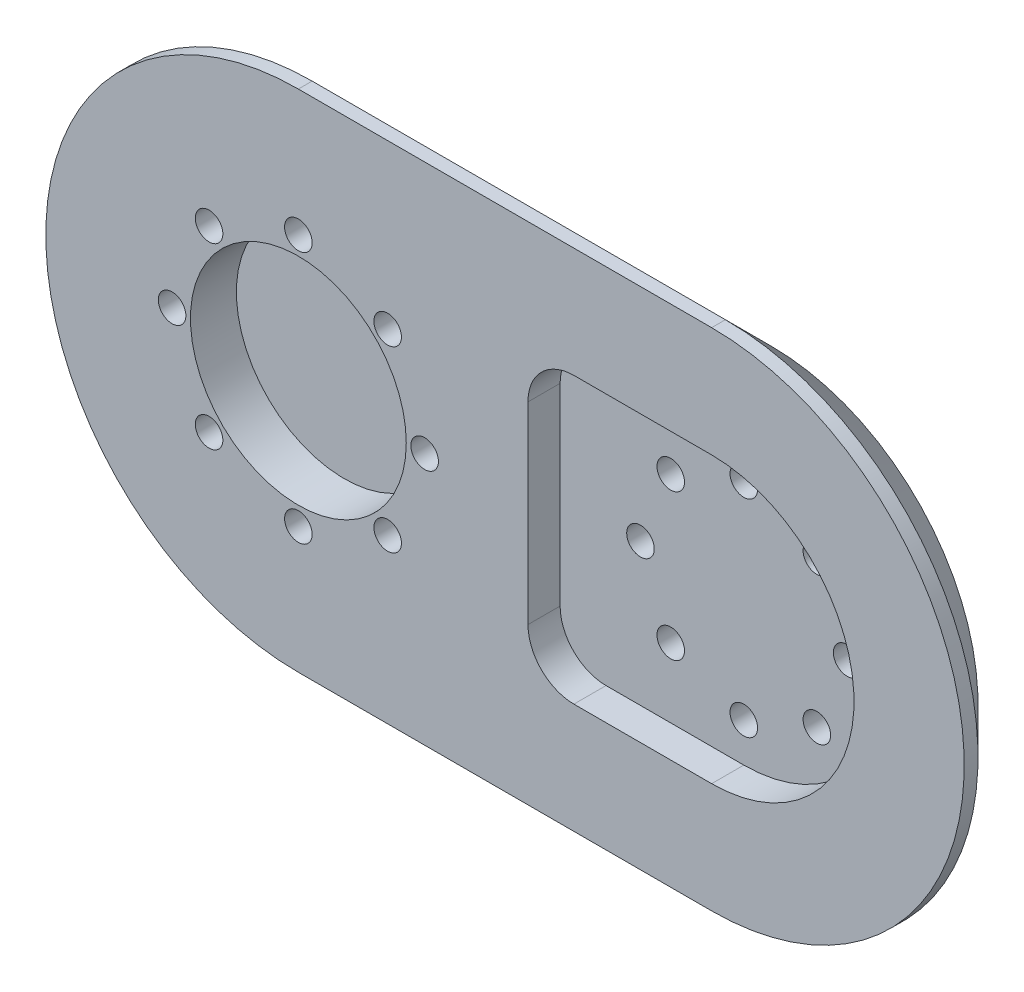
ISO-10303-21;
HEADER;
FILE_DESCRIPTION(('STEP AP214'),'2;1');
FILE_NAME('part.step','',(''),(''),'','','');
FILE_SCHEMA(('AUTOMOTIVE_DESIGN { 1 0 10303 214 1 1 1 1 }'));
ENDSEC;
DATA;
#1=APPLICATION_CONTEXT('core data for automotive mechanical design processes');
#2=APPLICATION_PROTOCOL_DEFINITION('international standard','automotive_design',2000,#1);
#3=PRODUCT_CONTEXT('',#1,'mechanical');
#4=PRODUCT('Part','Part','',(#3));
#5=PRODUCT_RELATED_PRODUCT_CATEGORY('part','',(#4));
#6=PRODUCT_DEFINITION_FORMATION('','',#4);
#7=PRODUCT_DEFINITION_CONTEXT('part definition',#1,'design');
#8=PRODUCT_DEFINITION('design','',#6,#7);
#9=PRODUCT_DEFINITION_SHAPE('','',#8);
#10=(LENGTH_UNIT() NAMED_UNIT(*) SI_UNIT(.MILLI.,.METRE.));
#11=(NAMED_UNIT(*) PLANE_ANGLE_UNIT() SI_UNIT($,.RADIAN.));
#12=(NAMED_UNIT(*) SI_UNIT($,.STERADIAN.) SOLID_ANGLE_UNIT());
#13=UNCERTAINTY_MEASURE_WITH_UNIT(LENGTH_MEASURE(1.E-05),#10,'distance_accuracy_value','');
#14=(GEOMETRIC_REPRESENTATION_CONTEXT(3) GLOBAL_UNCERTAINTY_ASSIGNED_CONTEXT((#13)) GLOBAL_UNIT_ASSIGNED_CONTEXT((#10,
#11,#12)) REPRESENTATION_CONTEXT('',''));
#15=CARTESIAN_POINT('',(0.,0.,0.));
#16=DIRECTION('',(0.,0.,1.));
#17=DIRECTION('',(1.,0.,0.));
#18=AXIS2_PLACEMENT_3D('',#15,#16,#17);
#19=CARTESIAN_POINT('',(0.,0.,13.));
#20=DIRECTION('',(0.,0.,-1.));
#21=DIRECTION('',(-1.,0.,0.));
#22=AXIS2_PLACEMENT_3D('',#19,#20,#21);
#23=CYLINDRICAL_SURFACE('',#22,55.);
#24=DIRECTION('',(0.,0.,-1.));
#25=VECTOR('',#24,1.);
#26=CARTESIAN_POINT('',(0.,55.,13.));
#27=LINE('',#26,#25);
#28=CARTESIAN_POINT('',(0.,55.,13.));
#29=VERTEX_POINT('',#28);
#30=CARTESIAN_POINT('',(0.,55.,10.));
#31=VERTEX_POINT('',#30);
#32=EDGE_CURVE('E155',#29,#31,#27,.T.);
#33=ORIENTED_EDGE('',*,*,#32,.T.);
#34=CARTESIAN_POINT('',(0.,0.,10.));
#35=DIRECTION('',(0.,0.,1.));
#36=DIRECTION('',(1.,0.,0.));
#37=AXIS2_PLACEMENT_3D('',#34,#35,#36);
#38=CIRCLE('',#37,55.);
#39=CARTESIAN_POINT('',(0.,-55.,10.));
#40=VERTEX_POINT('',#39);
#41=EDGE_CURVE('E211',#31,#40,#38,.T.);
#42=ORIENTED_EDGE('',*,*,#41,.T.);
#43=DIRECTION('',(0.,0.,-1.));
#44=VECTOR('',#43,1.);
#45=CARTESIAN_POINT('',(0.,-55.,13.));
#46=LINE('',#45,#44);
#47=CARTESIAN_POINT('',(0.,-55.,13.));
#48=VERTEX_POINT('',#47);
#49=EDGE_CURVE('E164',#48,#40,#46,.T.);
#50=ORIENTED_EDGE('',*,*,#49,.F.);
#51=CARTESIAN_POINT('',(0.,0.,13.));
#52=DIRECTION('',(0.,0.,1.));
#53=DIRECTION('',(1.,0.,0.));
#54=AXIS2_PLACEMENT_3D('',#51,#52,#53);
#55=CIRCLE('',#54,55.);
#56=EDGE_CURVE('E139',#29,#48,#55,.T.);
#57=ORIENTED_EDGE('',*,*,#56,.F.);
#58=EDGE_LOOP('',(#33,#42,#50,#57));
#59=FACE_BOUND('',#58,.T.);
#60=ADVANCED_FACE('F30',(#59),#23,.T.);
#61=CARTESIAN_POINT('',(0.,-55.,13.));
#62=DIRECTION('',(0.,1.,0.));
#63=DIRECTION('',(0.,0.,1.));
#64=AXIS2_PLACEMENT_3D('',#61,#62,#63);
#65=PLANE('',#64);
#66=ORIENTED_EDGE('',*,*,#49,.T.);
#67=DIRECTION('',(1.,0.,0.));
#68=VECTOR('',#67,1.);
#69=CARTESIAN_POINT('',(0.,-55.,10.));
#70=LINE('',#69,#68);
#71=CARTESIAN_POINT('',(90.,-55.,10.));
#72=VERTEX_POINT('',#71);
#73=EDGE_CURVE('E167',#40,#72,#70,.T.);
#74=ORIENTED_EDGE('',*,*,#73,.T.);
#75=DIRECTION('',(0.,0.,-1.));
#76=VECTOR('',#75,1.);
#77=CARTESIAN_POINT('',(90.,-55.,13.));
#78=LINE('',#77,#76);
#79=CARTESIAN_POINT('',(90.,-55.,13.));
#80=VERTEX_POINT('',#79);
#81=EDGE_CURVE('E161',#80,#72,#78,.T.);
#82=ORIENTED_EDGE('',*,*,#81,.F.);
#83=DIRECTION('',(1.,0.,0.));
#84=VECTOR('',#83,1.);
#85=CARTESIAN_POINT('',(0.,-55.,13.));
#86=LINE('',#85,#84);
#87=EDGE_CURVE('E142',#48,#80,#86,.T.);
#88=ORIENTED_EDGE('',*,*,#87,.F.);
#89=EDGE_LOOP('',(#66,#74,#82,#88));
#90=FACE_BOUND('',#89,.T.);
#91=ADVANCED_FACE('F302',(#90),#65,.F.);
#92=CARTESIAN_POINT('',(90.,0.,13.));
#93=DIRECTION('',(0.,0.,-1.));
#94=DIRECTION('',(-1.,0.,0.));
#95=AXIS2_PLACEMENT_3D('',#92,#93,#94);
#96=CYLINDRICAL_SURFACE('',#95,55.);
#97=ORIENTED_EDGE('',*,*,#81,.T.);
#98=CARTESIAN_POINT('',(90.,0.,10.));
#99=DIRECTION('',(0.,0.,1.));
#100=DIRECTION('',(1.,0.,0.));
#101=AXIS2_PLACEMENT_3D('',#98,#99,#100);
#102=CIRCLE('',#101,55.);
#103=CARTESIAN_POINT('',(90.,55.,10.));
#104=VERTEX_POINT('',#103);
#105=EDGE_CURVE('E209',#72,#104,#102,.T.);
#106=ORIENTED_EDGE('',*,*,#105,.T.);
#107=DIRECTION('',(0.,0.,-1.));
#108=VECTOR('',#107,1.);
#109=CARTESIAN_POINT('',(90.,55.,13.));
#110=LINE('',#109,#108);
#111=CARTESIAN_POINT('',(90.,55.,13.));
#112=VERTEX_POINT('',#111);
#113=EDGE_CURVE('E158',#112,#104,#110,.T.);
#114=ORIENTED_EDGE('',*,*,#113,.F.);
#115=CARTESIAN_POINT('',(90.,0.,13.));
#116=DIRECTION('',(0.,0.,1.));
#117=DIRECTION('',(1.,0.,0.));
#118=AXIS2_PLACEMENT_3D('',#115,#116,#117);
#119=CIRCLE('',#118,55.);
#120=EDGE_CURVE('E151',#80,#112,#119,.T.);
#121=ORIENTED_EDGE('',*,*,#120,.F.);
#122=EDGE_LOOP('',(#97,#106,#114,#121));
#123=FACE_BOUND('',#122,.T.);
#124=ADVANCED_FACE('F308',(#123),#96,.T.);
#125=CARTESIAN_POINT('',(0.,55.,13.));
#126=DIRECTION('',(0.,-1.,0.));
#127=DIRECTION('',(0.,0.,-1.));
#128=AXIS2_PLACEMENT_3D('',#125,#126,#127);
#129=PLANE('',#128);
#130=ORIENTED_EDGE('',*,*,#113,.T.);
#131=DIRECTION('',(-1.,0.,0.));
#132=VECTOR('',#131,1.);
#133=CARTESIAN_POINT('',(0.,55.,10.));
#134=LINE('',#133,#132);
#135=EDGE_CURVE('E213',#104,#31,#134,.T.);
#136=ORIENTED_EDGE('',*,*,#135,.T.);
#137=ORIENTED_EDGE('',*,*,#32,.F.);
#138=DIRECTION('',(-1.,0.,0.));
#139=VECTOR('',#138,1.);
#140=CARTESIAN_POINT('',(0.,55.,13.));
#141=LINE('',#140,#139);
#142=EDGE_CURVE('E153',#112,#29,#141,.T.);
#143=ORIENTED_EDGE('',*,*,#142,.F.);
#144=EDGE_LOOP('',(#130,#136,#137,#143));
#145=FACE_BOUND('',#144,.T.);
#146=ADVANCED_FACE('F521',(#145),#129,.F.);
#147=CARTESIAN_POINT('',(0.,0.,13.));
#148=DIRECTION('',(0.,0.,1.));
#149=DIRECTION('',(1.,0.,0.));
#150=AXIS2_PLACEMENT_3D('',#147,#148,#149);
#151=PLANE('',#150);
#152=CARTESIAN_POINT('',(0.,0.,13.));
#153=DIRECTION('',(0.,0.,1.));
#154=DIRECTION('',(1.,0.,0.));
#155=AXIS2_PLACEMENT_3D('',#152,#153,#154);
#156=CIRCLE('',#155,23.5);
#157=CARTESIAN_POINT('',(23.5,0.,13.));
#158=VERTEX_POINT('',#157);
#159=EDGE_CURVE('E646',#158,#158,#156,.T.);
#160=ORIENTED_EDGE('',*,*,#159,.F.);
#161=EDGE_LOOP('',(#160));
#162=FACE_BOUND('',#161,.T.);
#163=CARTESIAN_POINT('',(19.4454364826298,19.4454364826303,13.));
#164=DIRECTION('',(0.,0.,1.));
#165=DIRECTION('',(1.,0.,0.));
#166=AXIS2_PLACEMENT_3D('',#163,#164,#165);
#167=CIRCLE('',#166,3.);
#168=CARTESIAN_POINT('',(22.4454364826298,19.4454364826303,13.));
#169=VERTEX_POINT('',#168);
#170=EDGE_CURVE('E649',#169,#169,#167,.T.);
#171=ORIENTED_EDGE('',*,*,#170,.F.);
#172=EDGE_LOOP('',(#171));
#173=FACE_BOUND('',#172,.T.);
#174=CARTESIAN_POINT('',(27.4999999999996,-3.96569718509096E-13,13.));
#175=DIRECTION('',(0.,0.,1.));
#176=DIRECTION('',(1.,0.,0.));
#177=AXIS2_PLACEMENT_3D('',#174,#175,#176);
#178=CIRCLE('',#177,3.00000000000077);
#179=CARTESIAN_POINT('',(30.5000000000004,-3.96569718509096E-13,13.));
#180=VERTEX_POINT('',#179);
#181=EDGE_CURVE('E658',#180,#180,#178,.T.);
#182=ORIENTED_EDGE('',*,*,#181,.F.);
#183=EDGE_LOOP('',(#182));
#184=FACE_BOUND('',#183,.T.);
#185=CARTESIAN_POINT('',(19.4454364826294,-19.4454364826303,13.));
#186=DIRECTION('',(0.,0.,1.));
#187=DIRECTION('',(1.,0.,0.));
#188=AXIS2_PLACEMENT_3D('',#185,#186,#187);
#189=CIRCLE('',#188,3.00000000000095);
#190=CARTESIAN_POINT('',(22.4454364826303,-19.4454364826303,13.));
#191=VERTEX_POINT('',#190);
#192=EDGE_CURVE('E664',#191,#191,#189,.T.);
#193=ORIENTED_EDGE('',*,*,#192,.F.);
#194=EDGE_LOOP('',(#193));
#195=FACE_BOUND('',#194,.T.);
#196=CARTESIAN_POINT('',(-7.78877188487905E-13,-27.5,13.));
#197=DIRECTION('',(0.,0.,1.));
#198=DIRECTION('',(1.,0.,0.));
#199=AXIS2_PLACEMENT_3D('',#196,#197,#198);
#200=CIRCLE('',#199,3.00000000000093);
#201=CARTESIAN_POINT('',(3.00000000000015,-27.5,13.));
#202=VERTEX_POINT('',#201);
#203=EDGE_CURVE('E670',#202,#202,#200,.T.);
#204=ORIENTED_EDGE('',*,*,#203,.F.);
#205=EDGE_LOOP('',(#204));
#206=FACE_BOUND('',#205,.T.);
#207=CARTESIAN_POINT('',(-19.4454364826307,-19.4454364826298,13.));
#208=DIRECTION('',(0.,0.,1.));
#209=DIRECTION('',(1.,0.,0.));
#210=AXIS2_PLACEMENT_3D('',#207,#208,#209);
#211=CIRCLE('',#210,3.00000000000069);
#212=CARTESIAN_POINT('',(-16.44543648263,-19.4454364826298,13.));
#213=VERTEX_POINT('',#212);
#214=EDGE_CURVE('E676',#213,#213,#211,.T.);
#215=ORIENTED_EDGE('',*,*,#214,.F.);
#216=EDGE_LOOP('',(#215));
#217=FACE_BOUND('',#216,.T.);
#218=CARTESIAN_POINT('',(-27.5,0.,13.));
#219=DIRECTION('',(0.,0.,1.));
#220=DIRECTION('',(1.,0.,0.));
#221=AXIS2_PLACEMENT_3D('',#218,#219,#220);
#222=CIRCLE('',#221,3.);
#223=CARTESIAN_POINT('',(-24.5,0.,13.));
#224=VERTEX_POINT('',#223);
#225=EDGE_CURVE('E682',#224,#224,#222,.T.);
#226=ORIENTED_EDGE('',*,*,#225,.F.);
#227=EDGE_LOOP('',(#226));
#228=FACE_BOUND('',#227,.T.);
#229=CARTESIAN_POINT('',(-19.4454364826301,19.44543648263,13.));
#230=DIRECTION('',(0.,0.,1.));
#231=DIRECTION('',(1.,0.,0.));
#232=AXIS2_PLACEMENT_3D('',#229,#230,#231);
#233=CIRCLE('',#232,3.);
#234=CARTESIAN_POINT('',(-16.4454364826301,19.44543648263,13.));
#235=VERTEX_POINT('',#234);
#236=EDGE_CURVE('E688',#235,#235,#233,.T.);
#237=ORIENTED_EDGE('',*,*,#236,.F.);
#238=EDGE_LOOP('',(#237));
#239=FACE_BOUND('',#238,.T.);
#240=CARTESIAN_POINT('',(0.,27.5,13.));
#241=DIRECTION('',(0.,0.,1.));
#242=DIRECTION('',(1.,0.,0.));
#243=AXIS2_PLACEMENT_3D('',#240,#241,#242);
#244=CIRCLE('',#243,3.);
#245=CARTESIAN_POINT('',(3.,27.5,13.));
#246=VERTEX_POINT('',#245);
#247=EDGE_CURVE('E249',#246,#246,#244,.T.);
#248=ORIENTED_EDGE('',*,*,#247,.F.);
#249=EDGE_LOOP('',(#248));
#250=FACE_BOUND('',#249,.T.);
#251=DIRECTION('',(-1.,0.,0.));
#252=VECTOR('',#251,1.);
#253=CARTESIAN_POINT('',(50.,31.,13.));
#254=LINE('',#253,#252);
#255=CARTESIAN_POINT('',(90.,31.,13.));
#256=VERTEX_POINT('',#255);
#257=CARTESIAN_POINT('',(60.,31.,13.));
#258=VERTEX_POINT('',#257);
#259=EDGE_CURVE('E257',#256,#258,#254,.T.);
#260=ORIENTED_EDGE('',*,*,#259,.F.);
#261=CARTESIAN_POINT('',(90.,0.,13.));
#262=DIRECTION('',(0.,0.,1.));
#263=DIRECTION('',(1.,0.,0.));
#264=AXIS2_PLACEMENT_3D('',#261,#262,#263);
#265=CIRCLE('',#264,31.);
#266=CARTESIAN_POINT('',(90.,-31.,13.));
#267=VERTEX_POINT('',#266);
#268=EDGE_CURVE('E132',#267,#256,#265,.T.);
#269=ORIENTED_EDGE('',*,*,#268,.F.);
#270=DIRECTION('',(1.,0.,0.));
#271=VECTOR('',#270,1.);
#272=CARTESIAN_POINT('',(50.,-31.,13.));
#273=LINE('',#272,#271);
#274=CARTESIAN_POINT('',(60.,-31.,13.));
#275=VERTEX_POINT('',#274);
#276=EDGE_CURVE('E241',#275,#267,#273,.T.);
#277=ORIENTED_EDGE('',*,*,#276,.F.);
#278=CARTESIAN_POINT('',(60.,-21.,13.));
#279=DIRECTION('',(0.,0.,1.));
#280=DIRECTION('',(1.,0.,0.));
#281=AXIS2_PLACEMENT_3D('',#278,#279,#280);
#282=CIRCLE('',#281,10.);
#283=CARTESIAN_POINT('',(50.,-21.,13.));
#284=VERTEX_POINT('',#283);
#285=EDGE_CURVE('E38',#275,#284,#282,.F.);
#286=ORIENTED_EDGE('',*,*,#285,.T.);
#287=DIRECTION('',(0.,-1.,0.));
#288=VECTOR('',#287,1.);
#289=CARTESIAN_POINT('',(50.,31.,13.));
#290=LINE('',#289,#288);
#291=CARTESIAN_POINT('',(50.,21.,13.));
#292=VERTEX_POINT('',#291);
#293=EDGE_CURVE('E240',#292,#284,#290,.T.);
#294=ORIENTED_EDGE('',*,*,#293,.F.);
#295=CARTESIAN_POINT('',(60.,21.,13.));
#296=DIRECTION('',(0.,0.,1.));
#297=DIRECTION('',(1.,0.,0.));
#298=AXIS2_PLACEMENT_3D('',#295,#296,#297);
#299=CIRCLE('',#298,10.);
#300=EDGE_CURVE('E11',#292,#258,#299,.F.);
#301=ORIENTED_EDGE('',*,*,#300,.T.);
#302=EDGE_LOOP('',(#260,#269,#277,#286,#294,#301));
#303=FACE_BOUND('',#302,.T.);
#304=ORIENTED_EDGE('',*,*,#56,.T.);
#305=ORIENTED_EDGE('',*,*,#87,.T.);
#306=ORIENTED_EDGE('',*,*,#120,.T.);
#307=ORIENTED_EDGE('',*,*,#142,.T.);
#308=EDGE_LOOP('',(#304,#305,#306,#307));
#309=FACE_BOUND('',#308,.T.);
#310=ADVANCED_FACE('F238',(#162,#173,#184,#195,#206,#217,#228,#239,#250,#303,#309),#151,.T.);
#311=CARTESIAN_POINT('',(0.,0.,0.));
#312=DIRECTION('',(0.,0.,1.));
#313=DIRECTION('',(1.,0.,0.));
#314=AXIS2_PLACEMENT_3D('',#311,#312,#313);
#315=PLANE('',#314);
#316=CARTESIAN_POINT('',(19.4454364826298,19.4454364826303,0.));
#317=DIRECTION('',(0.,0.,-1.));
#318=DIRECTION('',(-1.,0.,0.));
#319=AXIS2_PLACEMENT_3D('',#316,#317,#318);
#320=CIRCLE('',#319,3.);
#321=CARTESIAN_POINT('',(16.4454364826298,19.4454364826303,0.));
#322=VERTEX_POINT('',#321);
#323=EDGE_CURVE('E645',#322,#322,#320,.T.);
#324=ORIENTED_EDGE('',*,*,#323,.F.);
#325=EDGE_LOOP('',(#324));
#326=FACE_BOUND('',#325,.T.);
#327=CARTESIAN_POINT('',(27.4999999999996,-3.96569718509096E-13,0.));
#328=DIRECTION('',(0.,0.,-1.));
#329=DIRECTION('',(-1.,0.,0.));
#330=AXIS2_PLACEMENT_3D('',#327,#328,#329);
#331=CIRCLE('',#330,3.00000000000077);
#332=CARTESIAN_POINT('',(24.4999999999988,-3.96569718509096E-13,0.));
#333=VERTEX_POINT('',#332);
#334=EDGE_CURVE('E655',#333,#333,#331,.T.);
#335=ORIENTED_EDGE('',*,*,#334,.F.);
#336=EDGE_LOOP('',(#335));
#337=FACE_BOUND('',#336,.T.);
#338=CARTESIAN_POINT('',(19.4454364826294,-19.4454364826303,0.));
#339=DIRECTION('',(0.,0.,-1.));
#340=DIRECTION('',(-1.,0.,0.));
#341=AXIS2_PLACEMENT_3D('',#338,#339,#340);
#342=CIRCLE('',#341,3.00000000000095);
#343=CARTESIAN_POINT('',(16.4454364826284,-19.4454364826303,0.));
#344=VERTEX_POINT('',#343);
#345=EDGE_CURVE('E661',#344,#344,#342,.T.);
#346=ORIENTED_EDGE('',*,*,#345,.F.);
#347=EDGE_LOOP('',(#346));
#348=FACE_BOUND('',#347,.T.);
#349=CARTESIAN_POINT('',(-7.78877188487905E-13,-27.5,0.));
#350=DIRECTION('',(0.,0.,-1.));
#351=DIRECTION('',(-1.,0.,0.));
#352=AXIS2_PLACEMENT_3D('',#349,#350,#351);
#353=CIRCLE('',#352,3.00000000000093);
#354=CARTESIAN_POINT('',(-3.00000000000171,-27.5,0.));
#355=VERTEX_POINT('',#354);
#356=EDGE_CURVE('E667',#355,#355,#353,.T.);
#357=ORIENTED_EDGE('',*,*,#356,.F.);
#358=EDGE_LOOP('',(#357));
#359=FACE_BOUND('',#358,.T.);
#360=CARTESIAN_POINT('',(-19.4454364826307,-19.4454364826298,0.));
#361=DIRECTION('',(0.,0.,-1.));
#362=DIRECTION('',(-1.,0.,0.));
#363=AXIS2_PLACEMENT_3D('',#360,#361,#362);
#364=CIRCLE('',#363,3.00000000000069);
#365=CARTESIAN_POINT('',(-22.4454364826314,-19.4454364826298,0.));
#366=VERTEX_POINT('',#365);
#367=EDGE_CURVE('E673',#366,#366,#364,.T.);
#368=ORIENTED_EDGE('',*,*,#367,.F.);
#369=EDGE_LOOP('',(#368));
#370=FACE_BOUND('',#369,.T.);
#371=CARTESIAN_POINT('',(-27.5,0.,0.));
#372=DIRECTION('',(0.,0.,-1.));
#373=DIRECTION('',(-1.,0.,0.));
#374=AXIS2_PLACEMENT_3D('',#371,#372,#373);
#375=CIRCLE('',#374,3.);
#376=CARTESIAN_POINT('',(-30.5,0.,0.));
#377=VERTEX_POINT('',#376);
#378=EDGE_CURVE('E679',#377,#377,#375,.T.);
#379=ORIENTED_EDGE('',*,*,#378,.F.);
#380=EDGE_LOOP('',(#379));
#381=FACE_BOUND('',#380,.T.);
#382=CARTESIAN_POINT('',(-19.4454364826301,19.44543648263,0.));
#383=DIRECTION('',(0.,0.,-1.));
#384=DIRECTION('',(-1.,0.,0.));
#385=AXIS2_PLACEMENT_3D('',#382,#383,#384);
#386=CIRCLE('',#385,3.);
#387=CARTESIAN_POINT('',(-22.4454364826301,19.44543648263,0.));
#388=VERTEX_POINT('',#387);
#389=EDGE_CURVE('E685',#388,#388,#386,.T.);
#390=ORIENTED_EDGE('',*,*,#389,.F.);
#391=EDGE_LOOP('',(#390));
#392=FACE_BOUND('',#391,.T.);
#393=CARTESIAN_POINT('',(0.,27.5,0.));
#394=DIRECTION('',(0.,0.,-1.));
#395=DIRECTION('',(-1.,0.,0.));
#396=AXIS2_PLACEMENT_3D('',#393,#394,#395);
#397=CIRCLE('',#396,3.);
#398=CARTESIAN_POINT('',(-3.,27.5,0.));
#399=VERTEX_POINT('',#398);
#400=EDGE_CURVE('E691',#399,#399,#397,.T.);
#401=ORIENTED_EDGE('',*,*,#400,.F.);
#402=EDGE_LOOP('',(#401));
#403=FACE_BOUND('',#402,.T.);
#404=CARTESIAN_POINT('',(90.,0.,0.));
#405=DIRECTION('',(0.,0.,1.));
#406=DIRECTION('',(1.,0.,0.));
#407=AXIS2_PLACEMENT_3D('',#404,#405,#406);
#408=CIRCLE('',#407,45.);
#409=CARTESIAN_POINT('',(90.,45.,0.));
#410=VERTEX_POINT('',#409);
#411=CARTESIAN_POINT('',(90.,-45.,0.));
#412=VERTEX_POINT('',#411);
#413=EDGE_CURVE('E204',#410,#412,#408,.F.);
#414=ORIENTED_EDGE('',*,*,#413,.T.);
#415=DIRECTION('',(-1.,0.,0.));
#416=VECTOR('',#415,1.);
#417=CARTESIAN_POINT('',(0.,-45.,0.));
#418=LINE('',#417,#416);
#419=CARTESIAN_POINT('',(0.,-45.,0.));
#420=VERTEX_POINT('',#419);
#421=EDGE_CURVE('E206',#412,#420,#418,.T.);
#422=ORIENTED_EDGE('',*,*,#421,.T.);
#423=CARTESIAN_POINT('',(0.,0.,0.));
#424=DIRECTION('',(0.,0.,1.));
#425=DIRECTION('',(1.,0.,0.));
#426=AXIS2_PLACEMENT_3D('',#423,#424,#425);
#427=CIRCLE('',#426,45.);
#428=CARTESIAN_POINT('',(0.,45.,0.));
#429=VERTEX_POINT('',#428);
#430=EDGE_CURVE('E202',#420,#429,#427,.F.);
#431=ORIENTED_EDGE('',*,*,#430,.T.);
#432=DIRECTION('',(1.,0.,0.));
#433=VECTOR('',#432,1.);
#434=CARTESIAN_POINT('',(0.,45.,0.));
#435=LINE('',#434,#433);
#436=EDGE_CURVE('E200',#429,#410,#435,.T.);
#437=ORIENTED_EDGE('',*,*,#436,.T.);
#438=EDGE_LOOP('',(#414,#422,#431,#437));
#439=FACE_BOUND('',#438,.T.);
#440=CARTESIAN_POINT('',(105.909902576697,15.9099025766976,0.));
#441=DIRECTION('',(0.,0.,-1.));
#442=DIRECTION('',(-1.,0.,0.));
#443=AXIS2_PLACEMENT_3D('',#440,#441,#442);
#444=CIRCLE('',#443,3.00000000000001);
#445=CARTESIAN_POINT('',(102.909902576697,15.9099025766976,0.));
#446=VERTEX_POINT('',#445);
#447=EDGE_CURVE('E197',#446,#446,#444,.T.);
#448=ORIENTED_EDGE('',*,*,#447,.F.);
#449=EDGE_LOOP('',(#448));
#450=FACE_BOUND('',#449,.T.);
#451=CARTESIAN_POINT('',(112.5,1.2490009027033E-13,0.));
#452=DIRECTION('',(0.,0.,-1.));
#453=DIRECTION('',(-1.,0.,0.));
#454=AXIS2_PLACEMENT_3D('',#451,#452,#453);
#455=CIRCLE('',#454,3.00000000000001);
#456=CARTESIAN_POINT('',(109.5,1.2490009027033E-13,0.));
#457=VERTEX_POINT('',#456);
#458=EDGE_CURVE('E193',#457,#457,#455,.T.);
#459=ORIENTED_EDGE('',*,*,#458,.F.);
#460=EDGE_LOOP('',(#459));
#461=FACE_BOUND('',#460,.T.);
#462=CARTESIAN_POINT('',(105.909902576697,-15.9099025766971,0.));
#463=DIRECTION('',(0.,0.,-1.));
#464=DIRECTION('',(-1.,0.,0.));
#465=AXIS2_PLACEMENT_3D('',#462,#463,#464);
#466=CIRCLE('',#465,3.00000000000001);
#467=CARTESIAN_POINT('',(102.909902576697,-15.9099025766971,0.));
#468=VERTEX_POINT('',#467);
#469=EDGE_CURVE('E189',#468,#468,#466,.T.);
#470=ORIENTED_EDGE('',*,*,#469,.F.);
#471=EDGE_LOOP('',(#470));
#472=FACE_BOUND('',#471,.T.);
#473=CARTESIAN_POINT('',(89.9999999999998,-22.4999999999982,0.));
#474=DIRECTION('',(0.,0.,-1.));
#475=DIRECTION('',(-1.,0.,0.));
#476=AXIS2_PLACEMENT_3D('',#473,#474,#475);
#477=CIRCLE('',#476,3.00000000000001);
#478=CARTESIAN_POINT('',(86.9999999999998,-22.4999999999982,0.));
#479=VERTEX_POINT('',#478);
#480=EDGE_CURVE('E185',#479,#479,#477,.T.);
#481=ORIENTED_EDGE('',*,*,#480,.F.);
#482=EDGE_LOOP('',(#481));
#483=FACE_BOUND('',#482,.T.);
#484=CARTESIAN_POINT('',(74.0900974233035,-15.9099025766959,0.));
#485=DIRECTION('',(0.,0.,-1.));
#486=DIRECTION('',(-1.,0.,0.));
#487=AXIS2_PLACEMENT_3D('',#484,#485,#486);
#488=CIRCLE('',#487,3.00000000000001);
#489=CARTESIAN_POINT('',(71.0900974233034,-15.9099025766959,0.));
#490=VERTEX_POINT('',#489);
#491=EDGE_CURVE('E181',#490,#490,#488,.T.);
#492=ORIENTED_EDGE('',*,*,#491,.F.);
#493=EDGE_LOOP('',(#492));
#494=FACE_BOUND('',#493,.T.);
#495=CARTESIAN_POINT('',(67.5000000000012,5.55111512312578E-13,0.));
#496=DIRECTION('',(0.,0.,-1.));
#497=DIRECTION('',(-1.,0.,0.));
#498=AXIS2_PLACEMENT_3D('',#495,#496,#497);
#499=CIRCLE('',#498,3.00000000000001);
#500=CARTESIAN_POINT('',(64.5000000000012,5.55111512312578E-13,0.));
#501=VERTEX_POINT('',#500);
#502=EDGE_CURVE('E177',#501,#501,#499,.T.);
#503=ORIENTED_EDGE('',*,*,#502,.F.);
#504=EDGE_LOOP('',(#503));
#505=FACE_BOUND('',#504,.T.);
#506=CARTESIAN_POINT('',(74.0900974233036,15.9099025766969,0.));
#507=DIRECTION('',(0.,0.,-1.));
#508=DIRECTION('',(-1.,0.,0.));
#509=AXIS2_PLACEMENT_3D('',#506,#507,#508);
#510=CIRCLE('',#509,3.00000000000001);
#511=CARTESIAN_POINT('',(71.0900974233036,15.9099025766969,0.));
#512=VERTEX_POINT('',#511);
#513=EDGE_CURVE('E173',#512,#512,#510,.T.);
#514=ORIENTED_EDGE('',*,*,#513,.F.);
#515=EDGE_LOOP('',(#514));
#516=FACE_BOUND('',#515,.T.);
#517=CARTESIAN_POINT('',(90.,22.4999999999991,0.));
#518=DIRECTION('',(0.,0.,-1.));
#519=DIRECTION('',(-1.,0.,0.));
#520=AXIS2_PLACEMENT_3D('',#517,#518,#519);
#521=CIRCLE('',#520,3.00000000000001);
#522=CARTESIAN_POINT('',(87.,22.4999999999991,0.));
#523=VERTEX_POINT('',#522);
#524=EDGE_CURVE('E147',#523,#523,#521,.T.);
#525=ORIENTED_EDGE('',*,*,#524,.F.);
#526=EDGE_LOOP('',(#525));
#527=FACE_BOUND('',#526,.T.);
#528=ADVANCED_FACE('F280',(#326,#337,#348,#359,#370,#381,#392,#403,#439,#450,#461,#472,#483,
#494,#505,#516,#527),#315,.F.);
#529=CARTESIAN_POINT('',(90.,0.,6.));
#530=DIRECTION('',(0.,0.,1.));
#531=DIRECTION('',(1.,0.,0.));
#532=AXIS2_PLACEMENT_3D('',#529,#530,#531);
#533=CYLINDRICAL_SURFACE('',#532,31.);
#534=ORIENTED_EDGE('',*,*,#268,.T.);
#535=DIRECTION('',(0.,0.,1.));
#536=VECTOR('',#535,1.);
#537=CARTESIAN_POINT('',(90.,31.,6.));
#538=LINE('',#537,#536);
#539=CARTESIAN_POINT('',(90.,31.,6.));
#540=VERTEX_POINT('',#539);
#541=EDGE_CURVE('E118',#540,#256,#538,.T.);
#542=ORIENTED_EDGE('',*,*,#541,.F.);
#543=CARTESIAN_POINT('',(90.,0.,6.));
#544=DIRECTION('',(0.,0.,1.));
#545=DIRECTION('',(1.,0.,0.));
#546=AXIS2_PLACEMENT_3D('',#543,#544,#545);
#547=CIRCLE('',#546,31.);
#548=CARTESIAN_POINT('',(90.,-31.,6.));
#549=VERTEX_POINT('',#548);
#550=EDGE_CURVE('E130',#549,#540,#547,.T.);
#551=ORIENTED_EDGE('',*,*,#550,.F.);
#552=DIRECTION('',(0.,0.,1.));
#553=VECTOR('',#552,1.);
#554=CARTESIAN_POINT('',(90.,-31.,6.));
#555=LINE('',#554,#553);
#556=EDGE_CURVE('E122',#549,#267,#555,.T.);
#557=ORIENTED_EDGE('',*,*,#556,.T.);
#558=EDGE_LOOP('',(#534,#542,#551,#557));
#559=FACE_BOUND('',#558,.T.);
#560=ADVANCED_FACE('F128',(#559),#533,.F.);
#561=CARTESIAN_POINT('',(90.,0.,6.));
#562=DIRECTION('',(0.,0.,1.));
#563=DIRECTION('',(1.,0.,0.));
#564=AXIS2_PLACEMENT_3D('',#561,#562,#563);
#565=PLANE('',#564);
#566=CARTESIAN_POINT('',(105.909902576697,15.9099025766976,6.));
#567=DIRECTION('',(0.,0.,1.));
#568=DIRECTION('',(1.,0.,0.));
#569=AXIS2_PLACEMENT_3D('',#566,#567,#568);
#570=CIRCLE('',#569,3.00000000000001);
#571=CARTESIAN_POINT('',(108.909902576697,15.9099025766976,6.));
#572=VERTEX_POINT('',#571);
#573=EDGE_CURVE('E194',#572,#572,#570,.T.);
#574=ORIENTED_EDGE('',*,*,#573,.F.);
#575=EDGE_LOOP('',(#574));
#576=FACE_BOUND('',#575,.T.);
#577=CARTESIAN_POINT('',(112.5,1.24608656726366E-13,6.));
#578=DIRECTION('',(0.,0.,1.));
#579=DIRECTION('',(1.,0.,0.));
#580=AXIS2_PLACEMENT_3D('',#577,#578,#579);
#581=CIRCLE('',#580,3.00000000000001);
#582=CARTESIAN_POINT('',(115.5,1.24608656726366E-13,6.));
#583=VERTEX_POINT('',#582);
#584=EDGE_CURVE('E190',#583,#583,#581,.T.);
#585=ORIENTED_EDGE('',*,*,#584,.F.);
#586=EDGE_LOOP('',(#585));
#587=FACE_BOUND('',#586,.T.);
#588=CARTESIAN_POINT('',(105.909902576697,-15.9099025766971,6.));
#589=DIRECTION('',(0.,0.,1.));
#590=DIRECTION('',(1.,0.,0.));
#591=AXIS2_PLACEMENT_3D('',#588,#589,#590);
#592=CIRCLE('',#591,3.00000000000001);
#593=CARTESIAN_POINT('',(108.909902576697,-15.9099025766971,6.));
#594=VERTEX_POINT('',#593);
#595=EDGE_CURVE('E186',#594,#594,#592,.T.);
#596=ORIENTED_EDGE('',*,*,#595,.F.);
#597=EDGE_LOOP('',(#596));
#598=FACE_BOUND('',#597,.T.);
#599=CARTESIAN_POINT('',(89.9999999999998,-22.4999999999982,6.));
#600=DIRECTION('',(0.,0.,1.));
#601=DIRECTION('',(1.,0.,0.));
#602=AXIS2_PLACEMENT_3D('',#599,#600,#601);
#603=CIRCLE('',#602,3.00000000000001);
#604=CARTESIAN_POINT('',(92.9999999999998,-22.4999999999982,6.));
#605=VERTEX_POINT('',#604);
#606=EDGE_CURVE('E182',#605,#605,#603,.T.);
#607=ORIENTED_EDGE('',*,*,#606,.F.);
#608=EDGE_LOOP('',(#607));
#609=FACE_BOUND('',#608,.T.);
#610=CARTESIAN_POINT('',(74.0900974233035,-15.9099025766959,6.));
#611=DIRECTION('',(0.,0.,1.));
#612=DIRECTION('',(1.,0.,0.));
#613=AXIS2_PLACEMENT_3D('',#610,#611,#612);
#614=CIRCLE('',#613,3.00000000000001);
#615=CARTESIAN_POINT('',(77.0900974233035,-15.9099025766959,6.));
#616=VERTEX_POINT('',#615);
#617=EDGE_CURVE('E178',#616,#616,#614,.T.);
#618=ORIENTED_EDGE('',*,*,#617,.F.);
#619=EDGE_LOOP('',(#618));
#620=FACE_BOUND('',#619,.T.);
#621=CARTESIAN_POINT('',(67.5000000000012,5.54820078768614E-13,6.));
#622=DIRECTION('',(0.,0.,1.));
#623=DIRECTION('',(1.,0.,0.));
#624=AXIS2_PLACEMENT_3D('',#621,#622,#623);
#625=CIRCLE('',#624,3.00000000000001);
#626=CARTESIAN_POINT('',(70.5000000000012,5.54820078768614E-13,6.));
#627=VERTEX_POINT('',#626);
#628=EDGE_CURVE('E174',#627,#627,#625,.T.);
#629=ORIENTED_EDGE('',*,*,#628,.F.);
#630=EDGE_LOOP('',(#629));
#631=FACE_BOUND('',#630,.T.);
#632=CARTESIAN_POINT('',(74.0900974233036,15.9099025766969,6.));
#633=DIRECTION('',(0.,0.,1.));
#634=DIRECTION('',(1.,0.,0.));
#635=AXIS2_PLACEMENT_3D('',#632,#633,#634);
#636=CIRCLE('',#635,3.00000000000001);
#637=CARTESIAN_POINT('',(77.0900974233036,15.9099025766969,6.));
#638=VERTEX_POINT('',#637);
#639=EDGE_CURVE('E170',#638,#638,#636,.T.);
#640=ORIENTED_EDGE('',*,*,#639,.F.);
#641=EDGE_LOOP('',(#640));
#642=FACE_BOUND('',#641,.T.);
#643=CARTESIAN_POINT('',(90.,22.4999999999991,6.));
#644=DIRECTION('',(0.,0.,1.));
#645=DIRECTION('',(1.,0.,0.));
#646=AXIS2_PLACEMENT_3D('',#643,#644,#645);
#647=CIRCLE('',#646,3.00000000000001);
#648=CARTESIAN_POINT('',(93.,22.4999999999991,6.));
#649=VERTEX_POINT('',#648);
#650=EDGE_CURVE('E144',#649,#649,#647,.T.);
#651=ORIENTED_EDGE('',*,*,#650,.F.);
#652=EDGE_LOOP('',(#651));
#653=FACE_BOUND('',#652,.T.);
#654=DIRECTION('',(0.,-1.,0.));
#655=VECTOR('',#654,1.);
#656=CARTESIAN_POINT('',(50.,31.,6.));
#657=LINE('',#656,#655);
#658=CARTESIAN_POINT('',(50.,21.,6.));
#659=VERTEX_POINT('',#658);
#660=CARTESIAN_POINT('',(50.,-21.,6.));
#661=VERTEX_POINT('',#660);
#662=EDGE_CURVE('E253',#659,#661,#657,.T.);
#663=ORIENTED_EDGE('',*,*,#662,.T.);
#664=CARTESIAN_POINT('',(60.,-21.,6.));
#665=DIRECTION('',(0.,0.,1.));
#666=DIRECTION('',(1.,0.,0.));
#667=AXIS2_PLACEMENT_3D('',#664,#665,#666);
#668=CIRCLE('',#667,10.);
#669=CARTESIAN_POINT('',(60.,-31.,6.));
#670=VERTEX_POINT('',#669);
#671=EDGE_CURVE('E234',#661,#670,#668,.T.);
#672=ORIENTED_EDGE('',*,*,#671,.T.);
#673=DIRECTION('',(1.,0.,0.));
#674=VECTOR('',#673,1.);
#675=CARTESIAN_POINT('',(50.,-31.,6.));
#676=LINE('',#675,#674);
#677=EDGE_CURVE('E123',#670,#549,#676,.T.);
#678=ORIENTED_EDGE('',*,*,#677,.T.);
#679=ORIENTED_EDGE('',*,*,#550,.T.);
#680=DIRECTION('',(-1.,0.,0.));
#681=VECTOR('',#680,1.);
#682=CARTESIAN_POINT('',(50.,31.,6.));
#683=LINE('',#682,#681);
#684=CARTESIAN_POINT('',(60.,31.,6.));
#685=VERTEX_POINT('',#684);
#686=EDGE_CURVE('E115',#540,#685,#683,.T.);
#687=ORIENTED_EDGE('',*,*,#686,.T.);
#688=CARTESIAN_POINT('',(60.,21.,6.));
#689=DIRECTION('',(0.,0.,1.));
#690=DIRECTION('',(1.,0.,0.));
#691=AXIS2_PLACEMENT_3D('',#688,#689,#690);
#692=CIRCLE('',#691,10.);
#693=EDGE_CURVE('E232',#685,#659,#692,.T.);
#694=ORIENTED_EDGE('',*,*,#693,.T.);
#695=EDGE_LOOP('',(#663,#672,#678,#679,#687,#694));
#696=FACE_BOUND('',#695,.T.);
#697=ADVANCED_FACE('F136',(#576,#587,#598,#609,#620,#631,#642,#653,#696),#565,.T.);
#698=CARTESIAN_POINT('',(90.,22.4999999999991,31.));
#699=DIRECTION('',(0.,0.,-1.));
#700=DIRECTION('',(-1.,0.,0.));
#701=AXIS2_PLACEMENT_3D('',#698,#699,#700);
#702=CYLINDRICAL_SURFACE('',#701,3.00000000000001);
#703=ORIENTED_EDGE('',*,*,#650,.T.);
#704=EDGE_LOOP('',(#703));
#705=FACE_BOUND('',#704,.T.);
#706=ORIENTED_EDGE('',*,*,#524,.T.);
#707=EDGE_LOOP('',(#706));
#708=FACE_BOUND('',#707,.T.);
#709=ADVANCED_FACE('F288',(#705,#708),#702,.F.);
#710=CARTESIAN_POINT('',(74.0900974233036,15.9099025766969,31.));
#711=DIRECTION('',(0.,0.,-1.));
#712=DIRECTION('',(-1.,0.,0.));
#713=AXIS2_PLACEMENT_3D('',#710,#711,#712);
#714=CYLINDRICAL_SURFACE('',#713,3.00000000000001);
#715=ORIENTED_EDGE('',*,*,#639,.T.);
#716=EDGE_LOOP('',(#715));
#717=FACE_BOUND('',#716,.T.);
#718=ORIENTED_EDGE('',*,*,#513,.T.);
#719=EDGE_LOOP('',(#718));
#720=FACE_BOUND('',#719,.T.);
#721=ADVANCED_FACE('F278',(#717,#720),#714,.F.);
#722=CARTESIAN_POINT('',(67.5000000000012,5.5360577233543E-13,31.));
#723=DIRECTION('',(0.,0.,-1.));
#724=DIRECTION('',(-1.,0.,0.));
#725=AXIS2_PLACEMENT_3D('',#722,#723,#724);
#726=CYLINDRICAL_SURFACE('',#725,3.00000000000001);
#727=ORIENTED_EDGE('',*,*,#628,.T.);
#728=EDGE_LOOP('',(#727));
#729=FACE_BOUND('',#728,.T.);
#730=ORIENTED_EDGE('',*,*,#502,.T.);
#731=EDGE_LOOP('',(#730));
#732=FACE_BOUND('',#731,.T.);
#733=ADVANCED_FACE('F296',(#729,#732),#726,.F.);
#734=CARTESIAN_POINT('',(74.0900974233035,-15.9099025766959,31.));
#735=DIRECTION('',(0.,0.,-1.));
#736=DIRECTION('',(-1.,0.,0.));
#737=AXIS2_PLACEMENT_3D('',#734,#735,#736);
#738=CYLINDRICAL_SURFACE('',#737,3.00000000000001);
#739=ORIENTED_EDGE('',*,*,#617,.T.);
#740=EDGE_LOOP('',(#739));
#741=FACE_BOUND('',#740,.T.);
#742=ORIENTED_EDGE('',*,*,#491,.T.);
#743=EDGE_LOOP('',(#742));
#744=FACE_BOUND('',#743,.T.);
#745=ADVANCED_FACE('F394',(#741,#744),#738,.F.);
#746=CARTESIAN_POINT('',(89.9999999999998,-22.4999999999982,31.));
#747=DIRECTION('',(0.,0.,-1.));
#748=DIRECTION('',(-1.,0.,0.));
#749=AXIS2_PLACEMENT_3D('',#746,#747,#748);
#750=CYLINDRICAL_SURFACE('',#749,3.00000000000001);
#751=ORIENTED_EDGE('',*,*,#606,.T.);
#752=EDGE_LOOP('',(#751));
#753=FACE_BOUND('',#752,.T.);
#754=ORIENTED_EDGE('',*,*,#480,.T.);
#755=EDGE_LOOP('',(#754));
#756=FACE_BOUND('',#755,.T.);
#757=ADVANCED_FACE('F390',(#753,#756),#750,.F.);
#758=CARTESIAN_POINT('',(105.909902576697,-15.9099025766971,31.));
#759=DIRECTION('',(0.,0.,-1.));
#760=DIRECTION('',(-1.,0.,0.));
#761=AXIS2_PLACEMENT_3D('',#758,#759,#760);
#762=CYLINDRICAL_SURFACE('',#761,3.00000000000001);
#763=ORIENTED_EDGE('',*,*,#595,.T.);
#764=EDGE_LOOP('',(#763));
#765=FACE_BOUND('',#764,.T.);
#766=ORIENTED_EDGE('',*,*,#469,.T.);
#767=EDGE_LOOP('',(#766));
#768=FACE_BOUND('',#767,.T.);
#769=ADVANCED_FACE('F386',(#765,#768),#762,.F.);
#770=CARTESIAN_POINT('',(112.5,1.23394350293182E-13,31.));
#771=DIRECTION('',(0.,0.,-1.));
#772=DIRECTION('',(-1.,0.,0.));
#773=AXIS2_PLACEMENT_3D('',#770,#771,#772);
#774=CYLINDRICAL_SURFACE('',#773,3.00000000000001);
#775=ORIENTED_EDGE('',*,*,#584,.T.);
#776=EDGE_LOOP('',(#775));
#777=FACE_BOUND('',#776,.T.);
#778=ORIENTED_EDGE('',*,*,#458,.T.);
#779=EDGE_LOOP('',(#778));
#780=FACE_BOUND('',#779,.T.);
#781=ADVANCED_FACE('F382',(#777,#780),#774,.F.);
#782=CARTESIAN_POINT('',(105.909902576697,15.9099025766976,31.));
#783=DIRECTION('',(0.,0.,-1.));
#784=DIRECTION('',(-1.,0.,0.));
#785=AXIS2_PLACEMENT_3D('',#782,#783,#784);
#786=CYLINDRICAL_SURFACE('',#785,3.00000000000001);
#787=ORIENTED_EDGE('',*,*,#573,.T.);
#788=EDGE_LOOP('',(#787));
#789=FACE_BOUND('',#788,.T.);
#790=ORIENTED_EDGE('',*,*,#447,.T.);
#791=EDGE_LOOP('',(#790));
#792=FACE_BOUND('',#791,.T.);
#793=ADVANCED_FACE('F327',(#789,#792),#786,.F.);
#794=CARTESIAN_POINT('',(0.,55.,10.));
#795=DIRECTION('',(0.,-0.707106781186547,0.707106781186549));
#796=DIRECTION('',(0.,-0.707106781186549,-0.707106781186547));
#797=AXIS2_PLACEMENT_3D('',#794,#795,#796);
#798=PLANE('',#797);
#799=DIRECTION('',(0.,0.707106781186549,0.707106781186547));
#800=VECTOR('',#799,1.);
#801=CARTESIAN_POINT('',(90.,45.,0.));
#802=LINE('',#801,#800);
#803=EDGE_CURVE('E219',#410,#104,#802,.T.);
#804=ORIENTED_EDGE('',*,*,#803,.F.);
#805=ORIENTED_EDGE('',*,*,#436,.F.);
#806=DIRECTION('',(0.,-0.707106781186549,-0.707106781186547));
#807=VECTOR('',#806,1.);
#808=CARTESIAN_POINT('',(0.,55.,10.));
#809=LINE('',#808,#807);
#810=EDGE_CURVE('E222',#31,#429,#809,.T.);
#811=ORIENTED_EDGE('',*,*,#810,.F.);
#812=ORIENTED_EDGE('',*,*,#135,.F.);
#813=EDGE_LOOP('',(#804,#805,#811,#812));
#814=FACE_BOUND('',#813,.T.);
#815=ADVANCED_FACE('F324',(#814),#798,.F.);
#816=CARTESIAN_POINT('',(0.,0.,10.));
#817=DIRECTION('',(0.,0.,1.));
#818=DIRECTION('',(1.,0.,0.));
#819=AXIS2_PLACEMENT_3D('',#816,#817,#818);
#820=CONICAL_SURFACE('',#819,55.,0.78539816339745);
#821=ORIENTED_EDGE('',*,*,#810,.T.);
#822=ORIENTED_EDGE('',*,*,#430,.F.);
#823=DIRECTION('',(0.,0.707106781186549,-0.707106781186547));
#824=VECTOR('',#823,1.);
#825=CARTESIAN_POINT('',(0.,-55.,10.));
#826=LINE('',#825,#824);
#827=EDGE_CURVE('E217',#40,#420,#826,.T.);
#828=ORIENTED_EDGE('',*,*,#827,.F.);
#829=ORIENTED_EDGE('',*,*,#41,.F.);
#830=EDGE_LOOP('',(#821,#822,#828,#829));
#831=FACE_BOUND('',#830,.T.);
#832=ADVANCED_FACE('F320',(#831),#820,.T.);
#833=CARTESIAN_POINT('',(90.,0.,10.));
#834=DIRECTION('',(0.,0.,1.));
#835=DIRECTION('',(1.,0.,0.));
#836=AXIS2_PLACEMENT_3D('',#833,#834,#835);
#837=CONICAL_SURFACE('',#836,55.,0.78539816339745);
#838=ORIENTED_EDGE('',*,*,#803,.T.);
#839=ORIENTED_EDGE('',*,*,#105,.F.);
#840=DIRECTION('',(0.,-0.707106781186549,0.707106781186547));
#841=VECTOR('',#840,1.);
#842=CARTESIAN_POINT('',(90.,-45.,0.));
#843=LINE('',#842,#841);
#844=EDGE_CURVE('E133',#412,#72,#843,.T.);
#845=ORIENTED_EDGE('',*,*,#844,.F.);
#846=ORIENTED_EDGE('',*,*,#413,.F.);
#847=EDGE_LOOP('',(#838,#839,#845,#846));
#848=FACE_BOUND('',#847,.T.);
#849=ADVANCED_FACE('F316',(#848),#837,.T.);
#850=CARTESIAN_POINT('',(0.,-55.,10.));
#851=DIRECTION('',(0.,0.707106781186547,0.707106781186549));
#852=DIRECTION('',(0.,-0.707106781186549,0.707106781186547));
#853=AXIS2_PLACEMENT_3D('',#850,#851,#852);
#854=PLANE('',#853);
#855=ORIENTED_EDGE('',*,*,#827,.T.);
#856=ORIENTED_EDGE('',*,*,#421,.F.);
#857=ORIENTED_EDGE('',*,*,#844,.T.);
#858=ORIENTED_EDGE('',*,*,#73,.F.);
#859=EDGE_LOOP('',(#855,#856,#857,#858));
#860=FACE_BOUND('',#859,.T.);
#861=ADVANCED_FACE('F313',(#860),#854,.F.);
#862=CARTESIAN_POINT('',(50.,31.,6.));
#863=DIRECTION('',(-1.,0.,0.));
#864=DIRECTION('',(0.,-1.,0.));
#865=AXIS2_PLACEMENT_3D('',#862,#863,#864);
#866=PLANE('',#865);
#867=ORIENTED_EDGE('',*,*,#293,.T.);
#868=DIRECTION('',(0.,0.,1.));
#869=VECTOR('',#868,1.);
#870=CARTESIAN_POINT('',(50.,-21.,6.));
#871=LINE('',#870,#869);
#872=EDGE_CURVE('E230',#284,#661,#871,.F.);
#873=ORIENTED_EDGE('',*,*,#872,.T.);
#874=ORIENTED_EDGE('',*,*,#662,.F.);
#875=DIRECTION('',(0.,0.,1.));
#876=VECTOR('',#875,1.);
#877=CARTESIAN_POINT('',(50.,21.,13.));
#878=LINE('',#877,#876);
#879=EDGE_CURVE('E227',#659,#292,#878,.T.);
#880=ORIENTED_EDGE('',*,*,#879,.T.);
#881=EDGE_LOOP('',(#867,#873,#874,#880));
#882=FACE_BOUND('',#881,.T.);
#883=ADVANCED_FACE('F246',(#882),#866,.F.);
#884=CARTESIAN_POINT('',(50.,31.,6.));
#885=DIRECTION('',(0.,1.,0.));
#886=DIRECTION('',(0.,0.,1.));
#887=AXIS2_PLACEMENT_3D('',#884,#885,#886);
#888=PLANE('',#887);
#889=ORIENTED_EDGE('',*,*,#259,.T.);
#890=DIRECTION('',(0.,0.,1.));
#891=VECTOR('',#890,1.);
#892=CARTESIAN_POINT('',(60.,31.,6.));
#893=LINE('',#892,#891);
#894=EDGE_CURVE('E50',#258,#685,#893,.F.);
#895=ORIENTED_EDGE('',*,*,#894,.T.);
#896=ORIENTED_EDGE('',*,*,#686,.F.);
#897=ORIENTED_EDGE('',*,*,#541,.T.);
#898=EDGE_LOOP('',(#889,#895,#896,#897));
#899=FACE_BOUND('',#898,.T.);
#900=ADVANCED_FACE('F117',(#899),#888,.F.);
#901=CARTESIAN_POINT('',(50.,-31.,6.));
#902=DIRECTION('',(0.,-1.,0.));
#903=DIRECTION('',(0.,0.,-1.));
#904=AXIS2_PLACEMENT_3D('',#901,#902,#903);
#905=PLANE('',#904);
#906=ORIENTED_EDGE('',*,*,#677,.F.);
#907=DIRECTION('',(0.,0.,1.));
#908=VECTOR('',#907,1.);
#909=CARTESIAN_POINT('',(60.,-31.,13.));
#910=LINE('',#909,#908);
#911=EDGE_CURVE('E215',#670,#275,#910,.T.);
#912=ORIENTED_EDGE('',*,*,#911,.T.);
#913=ORIENTED_EDGE('',*,*,#276,.T.);
#914=ORIENTED_EDGE('',*,*,#556,.F.);
#915=EDGE_LOOP('',(#906,#912,#913,#914));
#916=FACE_BOUND('',#915,.T.);
#917=ADVANCED_FACE('F255',(#916),#905,.F.);
#918=CARTESIAN_POINT('',(0.,27.5,80.));
#919=DIRECTION('',(0.,0.,-1.));
#920=DIRECTION('',(-1.,0.,0.));
#921=AXIS2_PLACEMENT_3D('',#918,#919,#920);
#922=CYLINDRICAL_SURFACE('',#921,3.);
#923=ORIENTED_EDGE('',*,*,#247,.T.);
#924=EDGE_LOOP('',(#923));
#925=FACE_BOUND('',#924,.T.);
#926=ORIENTED_EDGE('',*,*,#400,.T.);
#927=EDGE_LOOP('',(#926));
#928=FACE_BOUND('',#927,.T.);
#929=ADVANCED_FACE('F369',(#925,#928),#922,.F.);
#930=CARTESIAN_POINT('',(-19.4454364826301,19.44543648263,80.));
#931=DIRECTION('',(0.,0.,-1.));
#932=DIRECTION('',(-1.,0.,0.));
#933=AXIS2_PLACEMENT_3D('',#930,#931,#932);
#934=CYLINDRICAL_SURFACE('',#933,3.);
#935=ORIENTED_EDGE('',*,*,#236,.T.);
#936=EDGE_LOOP('',(#935));
#937=FACE_BOUND('',#936,.T.);
#938=ORIENTED_EDGE('',*,*,#389,.T.);
#939=EDGE_LOOP('',(#938));
#940=FACE_BOUND('',#939,.T.);
#941=ADVANCED_FACE('F365',(#937,#940),#934,.F.);
#942=CARTESIAN_POINT('',(-27.5,0.,80.));
#943=DIRECTION('',(0.,0.,-1.));
#944=DIRECTION('',(-1.,0.,0.));
#945=AXIS2_PLACEMENT_3D('',#942,#943,#944);
#946=CYLINDRICAL_SURFACE('',#945,3.);
#947=ORIENTED_EDGE('',*,*,#225,.T.);
#948=EDGE_LOOP('',(#947));
#949=FACE_BOUND('',#948,.T.);
#950=ORIENTED_EDGE('',*,*,#378,.T.);
#951=EDGE_LOOP('',(#950));
#952=FACE_BOUND('',#951,.T.);
#953=ADVANCED_FACE('F361',(#949,#952),#946,.F.);
#954=CARTESIAN_POINT('',(-19.4454364826307,-19.4454364826298,80.));
#955=DIRECTION('',(0.,0.,-1.));
#956=DIRECTION('',(-1.,0.,0.));
#957=AXIS2_PLACEMENT_3D('',#954,#955,#956);
#958=CYLINDRICAL_SURFACE('',#957,3.00000000000069);
#959=ORIENTED_EDGE('',*,*,#214,.T.);
#960=EDGE_LOOP('',(#959));
#961=FACE_BOUND('',#960,.T.);
#962=ORIENTED_EDGE('',*,*,#367,.T.);
#963=EDGE_LOOP('',(#962));
#964=FACE_BOUND('',#963,.T.);
#965=ADVANCED_FACE('F357',(#961,#964),#958,.F.);
#966=CARTESIAN_POINT('',(-7.78877188487905E-13,-27.5,80.));
#967=DIRECTION('',(0.,0.,-1.));
#968=DIRECTION('',(-1.,0.,0.));
#969=AXIS2_PLACEMENT_3D('',#966,#967,#968);
#970=CYLINDRICAL_SURFACE('',#969,3.00000000000093);
#971=ORIENTED_EDGE('',*,*,#203,.T.);
#972=EDGE_LOOP('',(#971));
#973=FACE_BOUND('',#972,.T.);
#974=ORIENTED_EDGE('',*,*,#356,.T.);
#975=EDGE_LOOP('',(#974));
#976=FACE_BOUND('',#975,.T.);
#977=ADVANCED_FACE('F353',(#973,#976),#970,.F.);
#978=CARTESIAN_POINT('',(19.4454364826294,-19.4454364826303,80.));
#979=DIRECTION('',(0.,0.,-1.));
#980=DIRECTION('',(-1.,0.,0.));
#981=AXIS2_PLACEMENT_3D('',#978,#979,#980);
#982=CYLINDRICAL_SURFACE('',#981,3.00000000000095);
#983=ORIENTED_EDGE('',*,*,#192,.T.);
#984=EDGE_LOOP('',(#983));
#985=FACE_BOUND('',#984,.T.);
#986=ORIENTED_EDGE('',*,*,#345,.T.);
#987=EDGE_LOOP('',(#986));
#988=FACE_BOUND('',#987,.T.);
#989=ADVANCED_FACE('F343',(#985,#988),#982,.F.);
#990=CARTESIAN_POINT('',(27.4999999999996,-3.96569718509096E-13,80.));
#991=DIRECTION('',(0.,0.,-1.));
#992=DIRECTION('',(-1.,0.,0.));
#993=AXIS2_PLACEMENT_3D('',#990,#991,#992);
#994=CYLINDRICAL_SURFACE('',#993,3.00000000000077);
#995=ORIENTED_EDGE('',*,*,#181,.T.);
#996=EDGE_LOOP('',(#995));
#997=FACE_BOUND('',#996,.T.);
#998=ORIENTED_EDGE('',*,*,#334,.T.);
#999=EDGE_LOOP('',(#998));
#1000=FACE_BOUND('',#999,.T.);
#1001=ADVANCED_FACE('F337',(#997,#1000),#994,.F.);
#1002=CARTESIAN_POINT('',(19.4454364826298,19.4454364826303,80.));
#1003=DIRECTION('',(0.,0.,-1.));
#1004=DIRECTION('',(-1.,0.,0.));
#1005=AXIS2_PLACEMENT_3D('',#1002,#1003,#1004);
#1006=CYLINDRICAL_SURFACE('',#1005,3.);
#1007=ORIENTED_EDGE('',*,*,#170,.T.);
#1008=EDGE_LOOP('',(#1007));
#1009=FACE_BOUND('',#1008,.T.);
#1010=ORIENTED_EDGE('',*,*,#323,.T.);
#1011=EDGE_LOOP('',(#1010));
#1012=FACE_BOUND('',#1011,.T.);
#1013=ADVANCED_FACE('F330',(#1009,#1012),#1006,.F.);
#1014=CARTESIAN_POINT('',(60.,-21.,6.));
#1015=DIRECTION('',(0.,0.,-1.));
#1016=DIRECTION('',(-1.,0.,0.));
#1017=AXIS2_PLACEMENT_3D('',#1014,#1015,#1016);
#1018=CYLINDRICAL_SURFACE('',#1017,10.);
#1019=ORIENTED_EDGE('',*,*,#671,.F.);
#1020=ORIENTED_EDGE('',*,*,#872,.F.);
#1021=ORIENTED_EDGE('',*,*,#285,.F.);
#1022=ORIENTED_EDGE('',*,*,#911,.F.);
#1023=EDGE_LOOP('',(#1019,#1020,#1021,#1022));
#1024=FACE_BOUND('',#1023,.T.);
#1025=ADVANCED_FACE('F252',(#1024),#1018,.F.);
#1026=CARTESIAN_POINT('',(60.,21.,6.));
#1027=DIRECTION('',(0.,0.,-1.));
#1028=DIRECTION('',(-1.,0.,0.));
#1029=AXIS2_PLACEMENT_3D('',#1026,#1027,#1028);
#1030=CYLINDRICAL_SURFACE('',#1029,10.);
#1031=ORIENTED_EDGE('',*,*,#693,.F.);
#1032=ORIENTED_EDGE('',*,*,#894,.F.);
#1033=ORIENTED_EDGE('',*,*,#300,.F.);
#1034=ORIENTED_EDGE('',*,*,#879,.F.);
#1035=EDGE_LOOP('',(#1031,#1032,#1033,#1034));
#1036=FACE_BOUND('',#1035,.T.);
#1037=ADVANCED_FACE('F32',(#1036),#1030,.F.);
#1038=CARTESIAN_POINT('',(0.,0.,3.));
#1039=DIRECTION('',(0.,0.,1.));
#1040=DIRECTION('',(1.,0.,0.));
#1041=AXIS2_PLACEMENT_3D('',#1038,#1039,#1040);
#1042=CYLINDRICAL_SURFACE('',#1041,23.5);
#1043=CARTESIAN_POINT('',(0.,0.,3.));
#1044=DIRECTION('',(0.,0.,1.));
#1045=DIRECTION('',(1.,0.,0.));
#1046=AXIS2_PLACEMENT_3D('',#1043,#1044,#1045);
#1047=CIRCLE('',#1046,23.5);
#1048=CARTESIAN_POINT('',(23.5,0.,3.));
#1049=VERTEX_POINT('',#1048);
#1050=EDGE_CURVE('E644',#1049,#1049,#1047,.T.);
#1051=ORIENTED_EDGE('',*,*,#1050,.F.);
#1052=EDGE_LOOP('',(#1051));
#1053=FACE_BOUND('',#1052,.T.);
#1054=ORIENTED_EDGE('',*,*,#159,.T.);
#1055=EDGE_LOOP('',(#1054));
#1056=FACE_BOUND('',#1055,.T.);
#1057=ADVANCED_FACE('F335',(#1053,#1056),#1042,.F.);
#1058=CARTESIAN_POINT('',(0.,0.,3.));
#1059=DIRECTION('',(0.,0.,1.));
#1060=DIRECTION('',(1.,0.,0.));
#1061=AXIS2_PLACEMENT_3D('',#1058,#1059,#1060);
#1062=PLANE('',#1061);
#1063=ORIENTED_EDGE('',*,*,#1050,.T.);
#1064=EDGE_LOOP('',(#1063));
#1065=FACE_BOUND('',#1064,.T.);
#1066=ADVANCED_FACE('F630',(#1065),#1062,.T.);
#1067=CLOSED_SHELL('',(#60,#91,#124,#146,#310,#528,#560,#697,#709,#721,#733,#745,#757,#769,#781,
#793,#815,#832,#849,#861,#883,#900,#917,#929,#941,#953,#965,#977,#989,#1001,#1013,#1025,#1037,
#1057,#1066));
#1068=MANIFOLD_SOLID_BREP('B2',#1067);
#1069=ADVANCED_BREP_SHAPE_REPRESENTATION('',(#18,#1068),#14);
#1070=SHAPE_DEFINITION_REPRESENTATION(#9,#1069);
ENDSEC;
END-ISO-10303-21;
